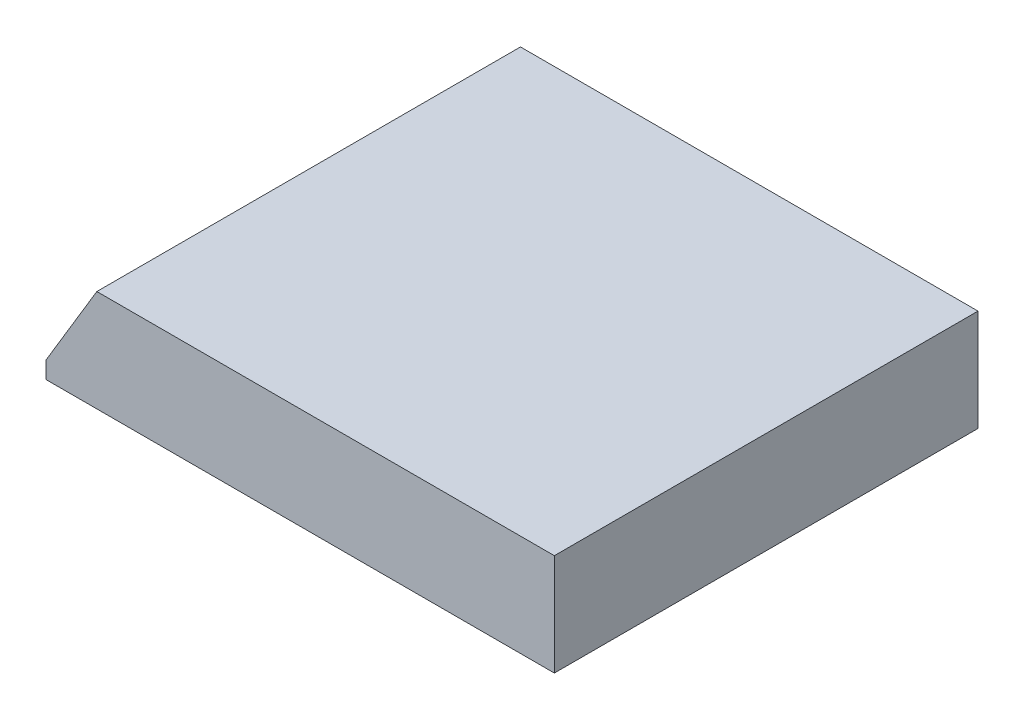
ISO-10303-21;
HEADER;
FILE_DESCRIPTION(('STEP AP214'),'2;1');
FILE_NAME('part.step','',(''),(''),'','','');
FILE_SCHEMA(('AUTOMOTIVE_DESIGN { 1 0 10303 214 1 1 1 1 }'));
ENDSEC;
DATA;
#1=APPLICATION_CONTEXT('core data for automotive mechanical design processes');
#2=APPLICATION_PROTOCOL_DEFINITION('international standard','automotive_design',2000,#1);
#3=PRODUCT_CONTEXT('',#1,'mechanical');
#4=PRODUCT('Part','Part','',(#3));
#5=PRODUCT_RELATED_PRODUCT_CATEGORY('part','',(#4));
#6=PRODUCT_DEFINITION_FORMATION('','',#4);
#7=PRODUCT_DEFINITION_CONTEXT('part definition',#1,'design');
#8=PRODUCT_DEFINITION('design','',#6,#7);
#9=PRODUCT_DEFINITION_SHAPE('','',#8);
#10=(LENGTH_UNIT() NAMED_UNIT(*) SI_UNIT(.MILLI.,.METRE.));
#11=(NAMED_UNIT(*) PLANE_ANGLE_UNIT() SI_UNIT($,.RADIAN.));
#12=(NAMED_UNIT(*) SI_UNIT($,.STERADIAN.) SOLID_ANGLE_UNIT());
#13=UNCERTAINTY_MEASURE_WITH_UNIT(LENGTH_MEASURE(1.E-05),#10,'distance_accuracy_value','');
#14=(GEOMETRIC_REPRESENTATION_CONTEXT(3) GLOBAL_UNCERTAINTY_ASSIGNED_CONTEXT((#13)) GLOBAL_UNIT_ASSIGNED_CONTEXT((#10,
#11,#12)) REPRESENTATION_CONTEXT('',''));
#15=CARTESIAN_POINT('',(0.,0.,0.));
#16=DIRECTION('',(0.,0.,1.));
#17=DIRECTION('',(1.,0.,0.));
#18=AXIS2_PLACEMENT_3D('',#15,#16,#17);
#19=CARTESIAN_POINT('',(0.,0.,50.));
#20=DIRECTION('',(1.,0.,0.));
#21=DIRECTION('',(0.,0.,-1.));
#22=AXIS2_PLACEMENT_3D('',#19,#20,#21);
#23=PLANE('',#22);
#24=DIRECTION('',(0.,-1.,0.));
#25=VECTOR('',#24,1.);
#26=CARTESIAN_POINT('',(0.,0.,50.));
#27=LINE('',#26,#25);
#28=CARTESIAN_POINT('',(0.,2.,50.));
#29=VERTEX_POINT('',#28);
#30=CARTESIAN_POINT('',(0.,0.,50.));
#31=VERTEX_POINT('',#30);
#32=EDGE_CURVE('E89',#29,#31,#27,.T.);
#33=ORIENTED_EDGE('',*,*,#32,.F.);
#34=DIRECTION('',(0.,0.,1.));
#35=VECTOR('',#34,1.);
#36=CARTESIAN_POINT('',(0.,2.,0.));
#37=LINE('',#36,#35);
#38=CARTESIAN_POINT('',(0.,2.,0.));
#39=VERTEX_POINT('',#38);
#40=EDGE_CURVE('E100',#39,#29,#37,.T.);
#41=ORIENTED_EDGE('',*,*,#40,.F.);
#42=DIRECTION('',(0.,-1.,0.));
#43=VECTOR('',#42,1.);
#44=CARTESIAN_POINT('',(0.,0.,0.));
#45=LINE('',#44,#43);
#46=CARTESIAN_POINT('',(0.,0.,0.));
#47=VERTEX_POINT('',#46);
#48=EDGE_CURVE('E110',#39,#47,#45,.T.);
#49=ORIENTED_EDGE('',*,*,#48,.T.);
#50=DIRECTION('',(0.,0.,-1.));
#51=VECTOR('',#50,1.);
#52=CARTESIAN_POINT('',(0.,0.,50.));
#53=LINE('',#52,#51);
#54=EDGE_CURVE('E11',#31,#47,#53,.T.);
#55=ORIENTED_EDGE('',*,*,#54,.F.);
#56=EDGE_LOOP('',(#33,#41,#49,#55));
#57=FACE_BOUND('',#56,.T.);
#58=ADVANCED_FACE('F43',(#57),#23,.F.);
#59=CARTESIAN_POINT('',(0.,0.,50.));
#60=DIRECTION('',(0.,1.,0.));
#61=DIRECTION('',(0.,0.,1.));
#62=AXIS2_PLACEMENT_3D('',#59,#60,#61);
#63=PLANE('',#62);
#64=DIRECTION('',(1.,0.,0.));
#65=VECTOR('',#64,1.);
#66=CARTESIAN_POINT('',(0.,0.,0.));
#67=LINE('',#66,#65);
#68=CARTESIAN_POINT('',(60.,0.,0.));
#69=VERTEX_POINT('',#68);
#70=EDGE_CURVE('E115',#47,#69,#67,.T.);
#71=ORIENTED_EDGE('',*,*,#70,.T.);
#72=DIRECTION('',(0.,0.,-1.));
#73=VECTOR('',#72,1.);
#74=CARTESIAN_POINT('',(60.,0.,50.));
#75=LINE('',#74,#73);
#76=CARTESIAN_POINT('',(60.,0.,50.));
#77=VERTEX_POINT('',#76);
#78=EDGE_CURVE('E51',#77,#69,#75,.T.);
#79=ORIENTED_EDGE('',*,*,#78,.F.);
#80=DIRECTION('',(1.,0.,0.));
#81=VECTOR('',#80,1.);
#82=CARTESIAN_POINT('',(0.,0.,50.));
#83=LINE('',#82,#81);
#84=EDGE_CURVE('E142',#31,#77,#83,.T.);
#85=ORIENTED_EDGE('',*,*,#84,.F.);
#86=ORIENTED_EDGE('',*,*,#54,.T.);
#87=EDGE_LOOP('',(#71,#79,#85,#86));
#88=FACE_BOUND('',#87,.T.);
#89=ADVANCED_FACE('F160',(#88),#63,.F.);
#90=CARTESIAN_POINT('',(60.,0.,50.));
#91=DIRECTION('',(-1.,0.,0.));
#92=DIRECTION('',(0.,0.,1.));
#93=AXIS2_PLACEMENT_3D('',#90,#91,#92);
#94=PLANE('',#93);
#95=DIRECTION('',(0.,1.,0.));
#96=VECTOR('',#95,1.);
#97=CARTESIAN_POINT('',(60.,0.,0.));
#98=LINE('',#97,#96);
#99=CARTESIAN_POINT('',(60.,12.,0.));
#100=VERTEX_POINT('',#99);
#101=EDGE_CURVE('E84',#69,#100,#98,.T.);
#102=ORIENTED_EDGE('',*,*,#101,.T.);
#103=DIRECTION('',(0.,0.,-1.));
#104=VECTOR('',#103,1.);
#105=CARTESIAN_POINT('',(60.,12.,50.));
#106=LINE('',#105,#104);
#107=CARTESIAN_POINT('',(60.,12.,50.));
#108=VERTEX_POINT('',#107);
#109=EDGE_CURVE('E131',#108,#100,#106,.T.);
#110=ORIENTED_EDGE('',*,*,#109,.F.);
#111=DIRECTION('',(0.,1.,0.));
#112=VECTOR('',#111,1.);
#113=CARTESIAN_POINT('',(60.,0.,50.));
#114=LINE('',#113,#112);
#115=EDGE_CURVE('E67',#77,#108,#114,.T.);
#116=ORIENTED_EDGE('',*,*,#115,.F.);
#117=ORIENTED_EDGE('',*,*,#78,.T.);
#118=EDGE_LOOP('',(#102,#110,#116,#117));
#119=FACE_BOUND('',#118,.T.);
#120=ADVANCED_FACE('F135',(#119),#94,.F.);
#121=CARTESIAN_POINT('',(0.,12.,50.));
#122=DIRECTION('',(0.,-1.,0.));
#123=DIRECTION('',(0.,0.,-1.));
#124=AXIS2_PLACEMENT_3D('',#121,#122,#123);
#125=PLANE('',#124);
#126=DIRECTION('',(-1.,0.,0.));
#127=VECTOR('',#126,1.);
#128=CARTESIAN_POINT('',(0.,12.,0.));
#129=LINE('',#128,#127);
#130=CARTESIAN_POINT('',(6.,12.,0.));
#131=VERTEX_POINT('',#130);
#132=EDGE_CURVE('E128',#100,#131,#129,.T.);
#133=ORIENTED_EDGE('',*,*,#132,.T.);
#134=DIRECTION('',(0.,0.,1.));
#135=VECTOR('',#134,1.);
#136=CARTESIAN_POINT('',(6.,12.,0.));
#137=LINE('',#136,#135);
#138=CARTESIAN_POINT('',(6.,12.,50.));
#139=VERTEX_POINT('',#138);
#140=EDGE_CURVE('E58',#131,#139,#137,.T.);
#141=ORIENTED_EDGE('',*,*,#140,.T.);
#142=DIRECTION('',(-1.,0.,0.));
#143=VECTOR('',#142,1.);
#144=CARTESIAN_POINT('',(0.,12.,50.));
#145=LINE('',#144,#143);
#146=EDGE_CURVE('E123',#108,#139,#145,.T.);
#147=ORIENTED_EDGE('',*,*,#146,.F.);
#148=ORIENTED_EDGE('',*,*,#109,.T.);
#149=EDGE_LOOP('',(#133,#141,#147,#148));
#150=FACE_BOUND('',#149,.T.);
#151=ADVANCED_FACE('F138',(#150),#125,.F.);
#152=CARTESIAN_POINT('',(0.,0.,50.));
#153=DIRECTION('',(0.,0.,-1.));
#154=DIRECTION('',(-1.,0.,0.));
#155=AXIS2_PLACEMENT_3D('',#152,#153,#154);
#156=PLANE('',#155);
#157=ORIENTED_EDGE('',*,*,#146,.T.);
#158=DIRECTION('',(0.514495755427526,0.857492925712544,0.));
#159=VECTOR('',#158,1.);
#160=CARTESIAN_POINT('',(0.,2.,50.));
#161=LINE('',#160,#159);
#162=EDGE_CURVE('E106',#29,#139,#161,.T.);
#163=ORIENTED_EDGE('',*,*,#162,.F.);
#164=ORIENTED_EDGE('',*,*,#32,.T.);
#165=ORIENTED_EDGE('',*,*,#84,.T.);
#166=ORIENTED_EDGE('',*,*,#115,.T.);
#167=EDGE_LOOP('',(#157,#163,#164,#165,#166));
#168=FACE_BOUND('',#167,.T.);
#169=ADVANCED_FACE('F149',(#168),#156,.F.);
#170=CARTESIAN_POINT('',(0.,0.,0.));
#171=DIRECTION('',(0.,0.,-1.));
#172=DIRECTION('',(-1.,0.,0.));
#173=AXIS2_PLACEMENT_3D('',#170,#171,#172);
#174=PLANE('',#173);
#175=DIRECTION('',(0.514495755427526,0.857492925712544,0.));
#176=VECTOR('',#175,1.);
#177=CARTESIAN_POINT('',(0.,2.,0.));
#178=LINE('',#177,#176);
#179=EDGE_CURVE('E97',#39,#131,#178,.T.);
#180=ORIENTED_EDGE('',*,*,#179,.T.);
#181=ORIENTED_EDGE('',*,*,#132,.F.);
#182=ORIENTED_EDGE('',*,*,#101,.F.);
#183=ORIENTED_EDGE('',*,*,#70,.F.);
#184=ORIENTED_EDGE('',*,*,#48,.F.);
#185=EDGE_LOOP('',(#180,#181,#182,#183,#184));
#186=FACE_BOUND('',#185,.T.);
#187=ADVANCED_FACE('F114',(#186),#174,.T.);
#188=CARTESIAN_POINT('',(0.,2.,0.));
#189=DIRECTION('',(0.857492925712544,-0.514495755427526,0.));
#190=DIRECTION('',(0.514495755427526,0.857492925712544,0.));
#191=AXIS2_PLACEMENT_3D('',#188,#189,#190);
#192=PLANE('',#191);
#193=ORIENTED_EDGE('',*,*,#162,.T.);
#194=ORIENTED_EDGE('',*,*,#140,.F.);
#195=ORIENTED_EDGE('',*,*,#179,.F.);
#196=ORIENTED_EDGE('',*,*,#40,.T.);
#197=EDGE_LOOP('',(#193,#194,#195,#196));
#198=FACE_BOUND('',#197,.T.);
#199=ADVANCED_FACE('F99',(#198),#192,.F.);
#200=CLOSED_SHELL('',(#58,#89,#120,#151,#169,#187,#199));
#201=MANIFOLD_SOLID_BREP('B2',#200);
#202=ADVANCED_BREP_SHAPE_REPRESENTATION('',(#18,#201),#14);
#203=SHAPE_DEFINITION_REPRESENTATION(#9,#202);
ENDSEC;
END-ISO-10303-21;
